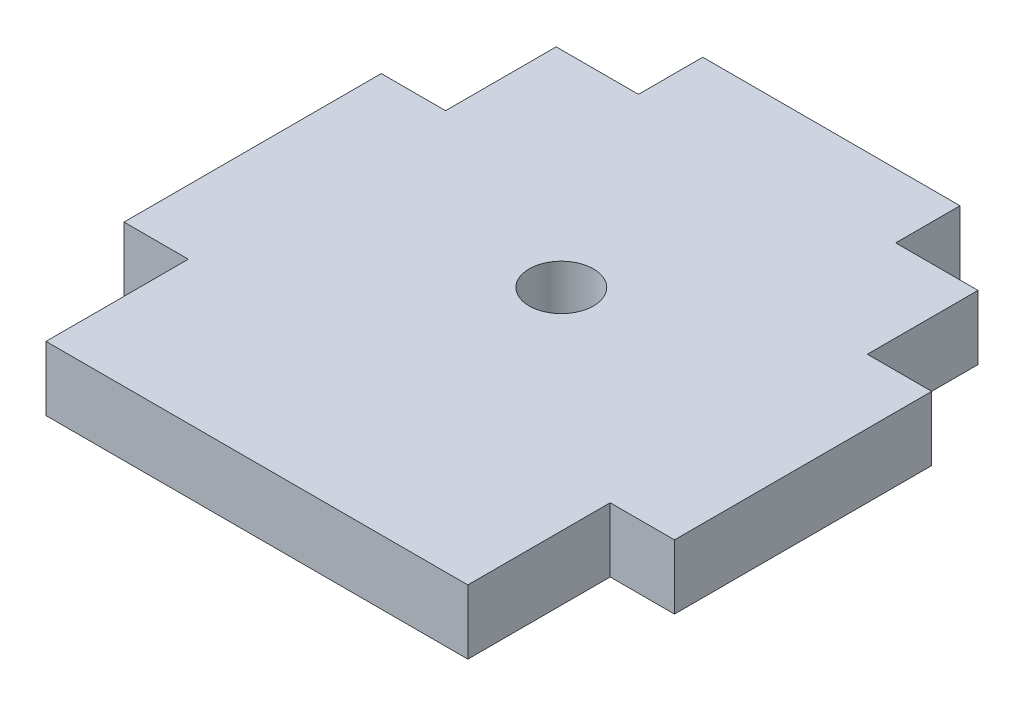
ISO-10303-21;
HEADER;
FILE_DESCRIPTION(('STEP AP214'),'2;1');
FILE_NAME('part.step','',(''),(''),'','','');
FILE_SCHEMA(('AUTOMOTIVE_DESIGN { 1 0 10303 214 1 1 1 1 }'));
ENDSEC;
DATA;
#1=APPLICATION_CONTEXT('core data for automotive mechanical design processes');
#2=APPLICATION_PROTOCOL_DEFINITION('international standard','automotive_design',2000,#1);
#3=PRODUCT_CONTEXT('',#1,'mechanical');
#4=PRODUCT('Part','Part','',(#3));
#5=PRODUCT_RELATED_PRODUCT_CATEGORY('part','',(#4));
#6=PRODUCT_DEFINITION_FORMATION('','',#4);
#7=PRODUCT_DEFINITION_CONTEXT('part definition',#1,'design');
#8=PRODUCT_DEFINITION('design','',#6,#7);
#9=PRODUCT_DEFINITION_SHAPE('','',#8);
#10=(LENGTH_UNIT() NAMED_UNIT(*) SI_UNIT(.MILLI.,.METRE.));
#11=(NAMED_UNIT(*) PLANE_ANGLE_UNIT() SI_UNIT($,.RADIAN.));
#12=(NAMED_UNIT(*) SI_UNIT($,.STERADIAN.) SOLID_ANGLE_UNIT());
#13=UNCERTAINTY_MEASURE_WITH_UNIT(LENGTH_MEASURE(1.E-05),#10,'distance_accuracy_value','');
#14=(GEOMETRIC_REPRESENTATION_CONTEXT(3) GLOBAL_UNCERTAINTY_ASSIGNED_CONTEXT((#13)) GLOBAL_UNIT_ASSIGNED_CONTEXT((#10,
#11,#12)) REPRESENTATION_CONTEXT('',''));
#15=CARTESIAN_POINT('',(0.,0.,0.));
#16=DIRECTION('',(0.,0.,1.));
#17=DIRECTION('',(1.,0.,0.));
#18=AXIS2_PLACEMENT_3D('',#15,#16,#17);
#19=CARTESIAN_POINT('',(0.,6.35,-14.0546666666667));
#20=DIRECTION('',(0.,1.,0.));
#21=DIRECTION('',(0.,0.,1.));
#22=AXIS2_PLACEMENT_3D('',#19,#20,#21);
#23=PLANE('',#22);
#24=DIRECTION('',(0.,0.,1.));
#25=VECTOR('',#24,1.);
#26=CARTESIAN_POINT('',(0.,6.35,0.));
#27=LINE('',#26,#25);
#28=CARTESIAN_POINT('',(0.,6.35,-14.0546666666667));
#29=VERTEX_POINT('',#28);
#30=CARTESIAN_POINT('',(0.,6.35,0.));
#31=VERTEX_POINT('',#30);
#32=EDGE_CURVE('E207',#29,#31,#27,.T.);
#33=ORIENTED_EDGE('',*,*,#32,.T.);
#34=DIRECTION('',(1.,0.,0.));
#35=VECTOR('',#34,1.);
#36=CARTESIAN_POINT('',(0.,6.35,0.));
#37=LINE('',#36,#35);
#38=CARTESIAN_POINT('',(41.656,6.35,0.));
#39=VERTEX_POINT('',#38);
#40=EDGE_CURVE('E115',#31,#39,#37,.T.);
#41=ORIENTED_EDGE('',*,*,#40,.T.);
#42=DIRECTION('',(0.,0.,-1.));
#43=VECTOR('',#42,1.);
#44=CARTESIAN_POINT('',(41.656,6.35,0.));
#45=LINE('',#44,#43);
#46=CARTESIAN_POINT('',(41.656,6.35,-14.0546666666667));
#47=VERTEX_POINT('',#46);
#48=EDGE_CURVE('E246',#39,#47,#45,.T.);
#49=ORIENTED_EDGE('',*,*,#48,.T.);
#50=DIRECTION('',(1.,0.,0.));
#51=VECTOR('',#50,1.);
#52=CARTESIAN_POINT('',(41.656,6.35,-14.0546666666667));
#53=LINE('',#52,#51);
#54=CARTESIAN_POINT('',(48.006,6.35,-14.0546666666667));
#55=VERTEX_POINT('',#54);
#56=EDGE_CURVE('E265',#47,#55,#53,.T.);
#57=ORIENTED_EDGE('',*,*,#56,.T.);
#58=DIRECTION('',(0.,0.,-1.));
#59=VECTOR('',#58,1.);
#60=CARTESIAN_POINT('',(48.006,6.35,-39.4546666666667));
#61=LINE('',#60,#59);
#62=CARTESIAN_POINT('',(48.006,6.35,-39.4546666666667));
#63=VERTEX_POINT('',#62);
#64=EDGE_CURVE('E262',#55,#63,#61,.T.);
#65=ORIENTED_EDGE('',*,*,#64,.T.);
#66=DIRECTION('',(-1.,0.,0.));
#67=VECTOR('',#66,1.);
#68=CARTESIAN_POINT('',(41.656,6.35,-39.4546666666667));
#69=LINE('',#68,#67);
#70=CARTESIAN_POINT('',(41.656,6.35,-39.4546666666667));
#71=VERTEX_POINT('',#70);
#72=EDGE_CURVE('E264',#63,#71,#69,.T.);
#73=ORIENTED_EDGE('',*,*,#72,.T.);
#74=DIRECTION('',(0.,0.,-1.));
#75=VECTOR('',#74,1.);
#76=CARTESIAN_POINT('',(41.656,6.35,-39.4546666666667));
#77=LINE('',#76,#75);
#78=CARTESIAN_POINT('',(41.656,6.35,-50.3766666666667));
#79=VERTEX_POINT('',#78);
#80=EDGE_CURVE('E267',#71,#79,#77,.T.);
#81=ORIENTED_EDGE('',*,*,#80,.T.);
#82=DIRECTION('',(-1.,0.,0.));
#83=VECTOR('',#82,1.);
#84=CARTESIAN_POINT('',(33.528,6.35,-50.3766666666667));
#85=LINE('',#84,#83);
#86=CARTESIAN_POINT('',(33.528,6.35,-50.3766666666667));
#87=VERTEX_POINT('',#86);
#88=EDGE_CURVE('E273',#79,#87,#85,.T.);
#89=ORIENTED_EDGE('',*,*,#88,.T.);
#90=DIRECTION('',(0.,0.,-1.));
#91=VECTOR('',#90,1.);
#92=CARTESIAN_POINT('',(33.528,6.35,-56.7266666666667));
#93=LINE('',#92,#91);
#94=CARTESIAN_POINT('',(33.528,6.35,-56.7266666666667));
#95=VERTEX_POINT('',#94);
#96=EDGE_CURVE('E275',#87,#95,#93,.T.);
#97=ORIENTED_EDGE('',*,*,#96,.T.);
#98=DIRECTION('',(-1.,0.,0.));
#99=VECTOR('',#98,1.);
#100=CARTESIAN_POINT('',(8.128,6.35,-56.7266666666667));
#101=LINE('',#100,#99);
#102=CARTESIAN_POINT('',(8.128,6.35,-56.7266666666667));
#103=VERTEX_POINT('',#102);
#104=EDGE_CURVE('E277',#95,#103,#101,.T.);
#105=ORIENTED_EDGE('',*,*,#104,.T.);
#106=DIRECTION('',(0.,0.,1.));
#107=VECTOR('',#106,1.);
#108=CARTESIAN_POINT('',(8.128,6.35,-50.3766666666667));
#109=LINE('',#108,#107);
#110=CARTESIAN_POINT('',(8.128,6.35,-50.3766666666667));
#111=VERTEX_POINT('',#110);
#112=EDGE_CURVE('E279',#103,#111,#109,.T.);
#113=ORIENTED_EDGE('',*,*,#112,.T.);
#114=DIRECTION('',(-1.,0.,0.));
#115=VECTOR('',#114,1.);
#116=CARTESIAN_POINT('',(0.,6.35,-50.3766666666667));
#117=LINE('',#116,#115);
#118=CARTESIAN_POINT('',(0.,6.35,-50.3766666666667));
#119=VERTEX_POINT('',#118);
#120=EDGE_CURVE('E281',#111,#119,#117,.T.);
#121=ORIENTED_EDGE('',*,*,#120,.T.);
#122=DIRECTION('',(0.,0.,1.));
#123=VECTOR('',#122,1.);
#124=CARTESIAN_POINT('',(0.,6.35,-39.4546666666667));
#125=LINE('',#124,#123);
#126=CARTESIAN_POINT('',(0.,6.35,-39.4546666666667));
#127=VERTEX_POINT('',#126);
#128=EDGE_CURVE('E158',#119,#127,#125,.T.);
#129=ORIENTED_EDGE('',*,*,#128,.T.);
#130=DIRECTION('',(-1.,0.,0.));
#131=VECTOR('',#130,1.);
#132=CARTESIAN_POINT('',(0.,6.35,-39.4546666666667));
#133=LINE('',#132,#131);
#134=CARTESIAN_POINT('',(-6.35,6.35,-39.4546666666667));
#135=VERTEX_POINT('',#134);
#136=EDGE_CURVE('E152',#127,#135,#133,.T.);
#137=ORIENTED_EDGE('',*,*,#136,.T.);
#138=DIRECTION('',(0.,0.,1.));
#139=VECTOR('',#138,1.);
#140=CARTESIAN_POINT('',(-6.35,6.35,-39.4546666666667));
#141=LINE('',#140,#139);
#142=CARTESIAN_POINT('',(-6.35,6.35,-14.0546666666667));
#143=VERTEX_POINT('',#142);
#144=EDGE_CURVE('E156',#135,#143,#141,.T.);
#145=ORIENTED_EDGE('',*,*,#144,.T.);
#146=DIRECTION('',(1.,0.,0.));
#147=VECTOR('',#146,1.);
#148=CARTESIAN_POINT('',(0.,6.35,-14.0546666666667));
#149=LINE('',#148,#147);
#150=EDGE_CURVE('E48',#143,#29,#149,.T.);
#151=ORIENTED_EDGE('',*,*,#150,.T.);
#152=EDGE_LOOP('',(#33,#41,#49,#57,#65,#73,#81,#89,#97,#105,#113,#121,#129,#137,#145,#151));
#153=FACE_BOUND('',#152,.T.);
#154=CARTESIAN_POINT('',(20.828,6.35,-30.0566666666667));
#155=DIRECTION('',(0.,1.,0.));
#156=DIRECTION('',(0.,0.,1.));
#157=AXIS2_PLACEMENT_3D('',#154,#155,#156);
#158=CIRCLE('',#157,3.175);
#159=CARTESIAN_POINT('',(20.828,6.35,-26.8816666666667));
#160=VERTEX_POINT('',#159);
#161=EDGE_CURVE('E180',#160,#160,#158,.T.);
#162=ORIENTED_EDGE('',*,*,#161,.F.);
#163=EDGE_LOOP('',(#162));
#164=FACE_BOUND('',#163,.T.);
#165=ADVANCED_FACE('F31',(#153,#164),#23,.T.);
#166=CARTESIAN_POINT('',(0.,0.,-14.0546666666667));
#167=DIRECTION('',(0.,1.,0.));
#168=DIRECTION('',(0.,0.,1.));
#169=AXIS2_PLACEMENT_3D('',#166,#167,#168);
#170=PLANE('',#169);
#171=DIRECTION('',(0.,0.,1.));
#172=VECTOR('',#171,1.);
#173=CARTESIAN_POINT('',(0.,0.,0.));
#174=LINE('',#173,#172);
#175=CARTESIAN_POINT('',(0.,0.,-14.0546666666667));
#176=VERTEX_POINT('',#175);
#177=CARTESIAN_POINT('',(0.,0.,0.));
#178=VERTEX_POINT('',#177);
#179=EDGE_CURVE('E176',#176,#178,#174,.T.);
#180=ORIENTED_EDGE('',*,*,#179,.F.);
#181=DIRECTION('',(1.,0.,0.));
#182=VECTOR('',#181,1.);
#183=CARTESIAN_POINT('',(0.,0.,-14.0546666666667));
#184=LINE('',#183,#182);
#185=CARTESIAN_POINT('',(-6.35,0.,-14.0546666666667));
#186=VERTEX_POINT('',#185);
#187=EDGE_CURVE('E107',#186,#176,#184,.T.);
#188=ORIENTED_EDGE('',*,*,#187,.F.);
#189=DIRECTION('',(0.,0.,1.));
#190=VECTOR('',#189,1.);
#191=CARTESIAN_POINT('',(-6.35,0.,-39.4546666666667));
#192=LINE('',#191,#190);
#193=CARTESIAN_POINT('',(-6.35,0.,-39.4546666666667));
#194=VERTEX_POINT('',#193);
#195=EDGE_CURVE('E101',#194,#186,#192,.T.);
#196=ORIENTED_EDGE('',*,*,#195,.F.);
#197=DIRECTION('',(-1.,0.,0.));
#198=VECTOR('',#197,1.);
#199=CARTESIAN_POINT('',(0.,0.,-39.4546666666667));
#200=LINE('',#199,#198);
#201=CARTESIAN_POINT('',(0.,0.,-39.4546666666667));
#202=VERTEX_POINT('',#201);
#203=EDGE_CURVE('E166',#202,#194,#200,.T.);
#204=ORIENTED_EDGE('',*,*,#203,.F.);
#205=DIRECTION('',(0.,0.,1.));
#206=VECTOR('',#205,1.);
#207=CARTESIAN_POINT('',(0.,0.,-39.4546666666667));
#208=LINE('',#207,#206);
#209=CARTESIAN_POINT('',(0.,0.,-50.3766666666667));
#210=VERTEX_POINT('',#209);
#211=EDGE_CURVE('E202',#210,#202,#208,.T.);
#212=ORIENTED_EDGE('',*,*,#211,.F.);
#213=DIRECTION('',(-1.,0.,0.));
#214=VECTOR('',#213,1.);
#215=CARTESIAN_POINT('',(0.,0.,-50.3766666666667));
#216=LINE('',#215,#214);
#217=CARTESIAN_POINT('',(8.128,0.,-50.3766666666667));
#218=VERTEX_POINT('',#217);
#219=EDGE_CURVE('E200',#218,#210,#216,.T.);
#220=ORIENTED_EDGE('',*,*,#219,.F.);
#221=DIRECTION('',(0.,0.,1.));
#222=VECTOR('',#221,1.);
#223=CARTESIAN_POINT('',(8.128,0.,-50.3766666666667));
#224=LINE('',#223,#222);
#225=CARTESIAN_POINT('',(8.128,0.,-56.7266666666667));
#226=VERTEX_POINT('',#225);
#227=EDGE_CURVE('E198',#226,#218,#224,.T.);
#228=ORIENTED_EDGE('',*,*,#227,.F.);
#229=DIRECTION('',(-1.,0.,0.));
#230=VECTOR('',#229,1.);
#231=CARTESIAN_POINT('',(8.128,0.,-56.7266666666667));
#232=LINE('',#231,#230);
#233=CARTESIAN_POINT('',(33.528,0.,-56.7266666666667));
#234=VERTEX_POINT('',#233);
#235=EDGE_CURVE('E196',#234,#226,#232,.T.);
#236=ORIENTED_EDGE('',*,*,#235,.F.);
#237=DIRECTION('',(0.,0.,-1.));
#238=VECTOR('',#237,1.);
#239=CARTESIAN_POINT('',(33.528,0.,-56.7266666666667));
#240=LINE('',#239,#238);
#241=CARTESIAN_POINT('',(33.528,0.,-50.3766666666667));
#242=VERTEX_POINT('',#241);
#243=EDGE_CURVE('E194',#242,#234,#240,.T.);
#244=ORIENTED_EDGE('',*,*,#243,.F.);
#245=DIRECTION('',(-1.,0.,0.));
#246=VECTOR('',#245,1.);
#247=CARTESIAN_POINT('',(33.528,0.,-50.3766666666667));
#248=LINE('',#247,#246);
#249=CARTESIAN_POINT('',(41.656,0.,-50.3766666666667));
#250=VERTEX_POINT('',#249);
#251=EDGE_CURVE('E192',#250,#242,#248,.T.);
#252=ORIENTED_EDGE('',*,*,#251,.F.);
#253=DIRECTION('',(0.,0.,-1.));
#254=VECTOR('',#253,1.);
#255=CARTESIAN_POINT('',(41.656,0.,-39.4546666666667));
#256=LINE('',#255,#254);
#257=CARTESIAN_POINT('',(41.656,0.,-39.4546666666667));
#258=VERTEX_POINT('',#257);
#259=EDGE_CURVE('E190',#258,#250,#256,.T.);
#260=ORIENTED_EDGE('',*,*,#259,.F.);
#261=DIRECTION('',(-1.,0.,0.));
#262=VECTOR('',#261,1.);
#263=CARTESIAN_POINT('',(41.656,0.,-39.4546666666667));
#264=LINE('',#263,#262);
#265=CARTESIAN_POINT('',(48.006,0.,-39.4546666666667));
#266=VERTEX_POINT('',#265);
#267=EDGE_CURVE('E188',#266,#258,#264,.T.);
#268=ORIENTED_EDGE('',*,*,#267,.F.);
#269=DIRECTION('',(0.,0.,-1.));
#270=VECTOR('',#269,1.);
#271=CARTESIAN_POINT('',(48.006,0.,-39.4546666666667));
#272=LINE('',#271,#270);
#273=CARTESIAN_POINT('',(48.006,0.,-14.0546666666667));
#274=VERTEX_POINT('',#273);
#275=EDGE_CURVE('E186',#274,#266,#272,.T.);
#276=ORIENTED_EDGE('',*,*,#275,.F.);
#277=DIRECTION('',(1.,0.,0.));
#278=VECTOR('',#277,1.);
#279=CARTESIAN_POINT('',(41.656,0.,-14.0546666666667));
#280=LINE('',#279,#278);
#281=CARTESIAN_POINT('',(41.656,0.,-14.0546666666667));
#282=VERTEX_POINT('',#281);
#283=EDGE_CURVE('E184',#282,#274,#280,.T.);
#284=ORIENTED_EDGE('',*,*,#283,.F.);
#285=DIRECTION('',(0.,0.,-1.));
#286=VECTOR('',#285,1.);
#287=CARTESIAN_POINT('',(41.656,0.,0.));
#288=LINE('',#287,#286);
#289=CARTESIAN_POINT('',(41.656,0.,0.));
#290=VERTEX_POINT('',#289);
#291=EDGE_CURVE('E182',#290,#282,#288,.T.);
#292=ORIENTED_EDGE('',*,*,#291,.F.);
#293=DIRECTION('',(1.,0.,0.));
#294=VECTOR('',#293,1.);
#295=CARTESIAN_POINT('',(0.,0.,0.));
#296=LINE('',#295,#294);
#297=EDGE_CURVE('E179',#178,#290,#296,.T.);
#298=ORIENTED_EDGE('',*,*,#297,.F.);
#299=EDGE_LOOP('',(#180,#188,#196,#204,#212,#220,#228,#236,#244,#252,#260,#268,#276,#284,#292,#298));
#300=FACE_BOUND('',#299,.T.);
#301=CARTESIAN_POINT('',(20.828,0.,-30.0566666666667));
#302=DIRECTION('',(0.,1.,0.));
#303=DIRECTION('',(0.,0.,1.));
#304=AXIS2_PLACEMENT_3D('',#301,#302,#303);
#305=CIRCLE('',#304,3.175);
#306=CARTESIAN_POINT('',(20.828,0.,-26.8816666666667));
#307=VERTEX_POINT('',#306);
#308=EDGE_CURVE('E480',#307,#307,#305,.T.);
#309=ORIENTED_EDGE('',*,*,#308,.T.);
#310=EDGE_LOOP('',(#309));
#311=FACE_BOUND('',#310,.T.);
#312=ADVANCED_FACE('F250',(#300,#311),#170,.F.);
#313=CARTESIAN_POINT('',(0.,6.35,0.));
#314=DIRECTION('',(1.,0.,0.));
#315=DIRECTION('',(0.,0.,-1.));
#316=AXIS2_PLACEMENT_3D('',#313,#314,#315);
#317=PLANE('',#316);
#318=ORIENTED_EDGE('',*,*,#179,.T.);
#319=DIRECTION('',(0.,-1.,0.));
#320=VECTOR('',#319,1.);
#321=CARTESIAN_POINT('',(0.,6.35,0.));
#322=LINE('',#321,#320);
#323=EDGE_CURVE('E11',#31,#178,#322,.T.);
#324=ORIENTED_EDGE('',*,*,#323,.F.);
#325=ORIENTED_EDGE('',*,*,#32,.F.);
#326=DIRECTION('',(0.,-1.,0.));
#327=VECTOR('',#326,1.);
#328=CARTESIAN_POINT('',(0.,6.35,-14.0546666666667));
#329=LINE('',#328,#327);
#330=EDGE_CURVE('E172',#29,#176,#329,.T.);
#331=ORIENTED_EDGE('',*,*,#330,.T.);
#332=EDGE_LOOP('',(#318,#324,#325,#331));
#333=FACE_BOUND('',#332,.T.);
#334=ADVANCED_FACE('F33',(#333),#317,.F.);
#335=CARTESIAN_POINT('',(0.,6.35,0.));
#336=DIRECTION('',(0.,0.,-1.));
#337=DIRECTION('',(-1.,0.,0.));
#338=AXIS2_PLACEMENT_3D('',#335,#336,#337);
#339=PLANE('',#338);
#340=ORIENTED_EDGE('',*,*,#297,.T.);
#341=DIRECTION('',(0.,-1.,0.));
#342=VECTOR('',#341,1.);
#343=CARTESIAN_POINT('',(41.656,6.35,0.));
#344=LINE('',#343,#342);
#345=EDGE_CURVE('E40',#39,#290,#344,.T.);
#346=ORIENTED_EDGE('',*,*,#345,.F.);
#347=ORIENTED_EDGE('',*,*,#40,.F.);
#348=ORIENTED_EDGE('',*,*,#323,.T.);
#349=EDGE_LOOP('',(#340,#346,#347,#348));
#350=FACE_BOUND('',#349,.T.);
#351=ADVANCED_FACE('F315',(#350),#339,.F.);
#352=CARTESIAN_POINT('',(41.656,6.35,0.));
#353=DIRECTION('',(-1.,0.,0.));
#354=DIRECTION('',(0.,0.,1.));
#355=AXIS2_PLACEMENT_3D('',#352,#353,#354);
#356=PLANE('',#355);
#357=ORIENTED_EDGE('',*,*,#291,.T.);
#358=DIRECTION('',(0.,-1.,0.));
#359=VECTOR('',#358,1.);
#360=CARTESIAN_POINT('',(41.656,6.35,-14.0546666666667));
#361=LINE('',#360,#359);
#362=EDGE_CURVE('E238',#47,#282,#361,.T.);
#363=ORIENTED_EDGE('',*,*,#362,.F.);
#364=ORIENTED_EDGE('',*,*,#48,.F.);
#365=ORIENTED_EDGE('',*,*,#345,.T.);
#366=EDGE_LOOP('',(#357,#363,#364,#365));
#367=FACE_BOUND('',#366,.T.);
#368=ADVANCED_FACE('F244',(#367),#356,.F.);
#369=CARTESIAN_POINT('',(41.656,6.35,-14.0546666666667));
#370=DIRECTION('',(0.,0.,-1.));
#371=DIRECTION('',(-1.,0.,0.));
#372=AXIS2_PLACEMENT_3D('',#369,#370,#371);
#373=PLANE('',#372);
#374=ORIENTED_EDGE('',*,*,#283,.T.);
#375=DIRECTION('',(0.,-1.,0.));
#376=VECTOR('',#375,1.);
#377=CARTESIAN_POINT('',(48.006,6.35,-14.0546666666667));
#378=LINE('',#377,#376);
#379=EDGE_CURVE('E235',#55,#274,#378,.T.);
#380=ORIENTED_EDGE('',*,*,#379,.F.);
#381=ORIENTED_EDGE('',*,*,#56,.F.);
#382=ORIENTED_EDGE('',*,*,#362,.T.);
#383=EDGE_LOOP('',(#374,#380,#381,#382));
#384=FACE_BOUND('',#383,.T.);
#385=ADVANCED_FACE('F256',(#384),#373,.F.);
#386=CARTESIAN_POINT('',(48.006,6.35,-39.4546666666667));
#387=DIRECTION('',(-1.,0.,0.));
#388=DIRECTION('',(0.,0.,1.));
#389=AXIS2_PLACEMENT_3D('',#386,#387,#388);
#390=PLANE('',#389);
#391=ORIENTED_EDGE('',*,*,#275,.T.);
#392=DIRECTION('',(0.,-1.,0.));
#393=VECTOR('',#392,1.);
#394=CARTESIAN_POINT('',(48.006,6.35,-39.4546666666667));
#395=LINE('',#394,#393);
#396=EDGE_CURVE('E232',#63,#266,#395,.T.);
#397=ORIENTED_EDGE('',*,*,#396,.F.);
#398=ORIENTED_EDGE('',*,*,#64,.F.);
#399=ORIENTED_EDGE('',*,*,#379,.T.);
#400=EDGE_LOOP('',(#391,#397,#398,#399));
#401=FACE_BOUND('',#400,.T.);
#402=ADVANCED_FACE('F260',(#401),#390,.F.);
#403=CARTESIAN_POINT('',(41.656,6.35,-39.4546666666667));
#404=DIRECTION('',(0.,0.,1.));
#405=DIRECTION('',(1.,0.,0.));
#406=AXIS2_PLACEMENT_3D('',#403,#404,#405);
#407=PLANE('',#406);
#408=ORIENTED_EDGE('',*,*,#267,.T.);
#409=DIRECTION('',(0.,-1.,0.));
#410=VECTOR('',#409,1.);
#411=CARTESIAN_POINT('',(41.656,6.35,-39.4546666666667));
#412=LINE('',#411,#410);
#413=EDGE_CURVE('E229',#71,#258,#412,.T.);
#414=ORIENTED_EDGE('',*,*,#413,.F.);
#415=ORIENTED_EDGE('',*,*,#72,.F.);
#416=ORIENTED_EDGE('',*,*,#396,.T.);
#417=EDGE_LOOP('',(#408,#414,#415,#416));
#418=FACE_BOUND('',#417,.T.);
#419=ADVANCED_FACE('F328',(#418),#407,.F.);
#420=CARTESIAN_POINT('',(41.656,6.35,-39.4546666666667));
#421=DIRECTION('',(-1.,0.,0.));
#422=DIRECTION('',(0.,0.,1.));
#423=AXIS2_PLACEMENT_3D('',#420,#421,#422);
#424=PLANE('',#423);
#425=ORIENTED_EDGE('',*,*,#259,.T.);
#426=DIRECTION('',(0.,-1.,0.));
#427=VECTOR('',#426,1.);
#428=CARTESIAN_POINT('',(41.656,6.35,-50.3766666666667));
#429=LINE('',#428,#427);
#430=EDGE_CURVE('E226',#79,#250,#429,.T.);
#431=ORIENTED_EDGE('',*,*,#430,.F.);
#432=ORIENTED_EDGE('',*,*,#80,.F.);
#433=ORIENTED_EDGE('',*,*,#413,.T.);
#434=EDGE_LOOP('',(#425,#431,#432,#433));
#435=FACE_BOUND('',#434,.T.);
#436=ADVANCED_FACE('F331',(#435),#424,.F.);
#437=CARTESIAN_POINT('',(33.528,6.35,-50.3766666666667));
#438=DIRECTION('',(0.,0.,1.));
#439=DIRECTION('',(1.,0.,0.));
#440=AXIS2_PLACEMENT_3D('',#437,#438,#439);
#441=PLANE('',#440);
#442=ORIENTED_EDGE('',*,*,#251,.T.);
#443=DIRECTION('',(0.,-1.,0.));
#444=VECTOR('',#443,1.);
#445=CARTESIAN_POINT('',(33.528,6.35,-50.3766666666667));
#446=LINE('',#445,#444);
#447=EDGE_CURVE('E223',#87,#242,#446,.T.);
#448=ORIENTED_EDGE('',*,*,#447,.F.);
#449=ORIENTED_EDGE('',*,*,#88,.F.);
#450=ORIENTED_EDGE('',*,*,#430,.T.);
#451=EDGE_LOOP('',(#442,#448,#449,#450));
#452=FACE_BOUND('',#451,.T.);
#453=ADVANCED_FACE('F335',(#452),#441,.F.);
#454=CARTESIAN_POINT('',(33.528,6.35,-56.7266666666667));
#455=DIRECTION('',(-1.,0.,0.));
#456=DIRECTION('',(0.,0.,1.));
#457=AXIS2_PLACEMENT_3D('',#454,#455,#456);
#458=PLANE('',#457);
#459=ORIENTED_EDGE('',*,*,#243,.T.);
#460=DIRECTION('',(0.,-1.,0.));
#461=VECTOR('',#460,1.);
#462=CARTESIAN_POINT('',(33.528,6.35,-56.7266666666667));
#463=LINE('',#462,#461);
#464=EDGE_CURVE('E220',#95,#234,#463,.T.);
#465=ORIENTED_EDGE('',*,*,#464,.F.);
#466=ORIENTED_EDGE('',*,*,#96,.F.);
#467=ORIENTED_EDGE('',*,*,#447,.T.);
#468=EDGE_LOOP('',(#459,#465,#466,#467));
#469=FACE_BOUND('',#468,.T.);
#470=ADVANCED_FACE('F339',(#469),#458,.F.);
#471=CARTESIAN_POINT('',(8.128,6.35,-56.7266666666667));
#472=DIRECTION('',(0.,0.,1.));
#473=DIRECTION('',(1.,0.,0.));
#474=AXIS2_PLACEMENT_3D('',#471,#472,#473);
#475=PLANE('',#474);
#476=ORIENTED_EDGE('',*,*,#235,.T.);
#477=DIRECTION('',(0.,-1.,0.));
#478=VECTOR('',#477,1.);
#479=CARTESIAN_POINT('',(8.128,6.35,-56.7266666666667));
#480=LINE('',#479,#478);
#481=EDGE_CURVE('E217',#103,#226,#480,.T.);
#482=ORIENTED_EDGE('',*,*,#481,.F.);
#483=ORIENTED_EDGE('',*,*,#104,.F.);
#484=ORIENTED_EDGE('',*,*,#464,.T.);
#485=EDGE_LOOP('',(#476,#482,#483,#484));
#486=FACE_BOUND('',#485,.T.);
#487=ADVANCED_FACE('F343',(#486),#475,.F.);
#488=CARTESIAN_POINT('',(8.128,6.35,-50.3766666666667));
#489=DIRECTION('',(1.,0.,0.));
#490=DIRECTION('',(0.,0.,-1.));
#491=AXIS2_PLACEMENT_3D('',#488,#489,#490);
#492=PLANE('',#491);
#493=ORIENTED_EDGE('',*,*,#227,.T.);
#494=DIRECTION('',(0.,-1.,0.));
#495=VECTOR('',#494,1.);
#496=CARTESIAN_POINT('',(8.128,6.35,-50.3766666666667));
#497=LINE('',#496,#495);
#498=EDGE_CURVE('E214',#111,#218,#497,.T.);
#499=ORIENTED_EDGE('',*,*,#498,.F.);
#500=ORIENTED_EDGE('',*,*,#112,.F.);
#501=ORIENTED_EDGE('',*,*,#481,.T.);
#502=EDGE_LOOP('',(#493,#499,#500,#501));
#503=FACE_BOUND('',#502,.T.);
#504=ADVANCED_FACE('F347',(#503),#492,.F.);
#505=CARTESIAN_POINT('',(0.,6.35,-50.3766666666667));
#506=DIRECTION('',(0.,0.,1.));
#507=DIRECTION('',(1.,0.,0.));
#508=AXIS2_PLACEMENT_3D('',#505,#506,#507);
#509=PLANE('',#508);
#510=ORIENTED_EDGE('',*,*,#219,.T.);
#511=DIRECTION('',(0.,-1.,0.));
#512=VECTOR('',#511,1.);
#513=CARTESIAN_POINT('',(0.,6.35,-50.3766666666667));
#514=LINE('',#513,#512);
#515=EDGE_CURVE('E211',#119,#210,#514,.T.);
#516=ORIENTED_EDGE('',*,*,#515,.F.);
#517=ORIENTED_EDGE('',*,*,#120,.F.);
#518=ORIENTED_EDGE('',*,*,#498,.T.);
#519=EDGE_LOOP('',(#510,#516,#517,#518));
#520=FACE_BOUND('',#519,.T.);
#521=ADVANCED_FACE('F287',(#520),#509,.F.);
#522=CARTESIAN_POINT('',(0.,6.35,-39.4546666666667));
#523=DIRECTION('',(1.,0.,0.));
#524=DIRECTION('',(0.,0.,-1.));
#525=AXIS2_PLACEMENT_3D('',#522,#523,#524);
#526=PLANE('',#525);
#527=ORIENTED_EDGE('',*,*,#211,.T.);
#528=DIRECTION('',(0.,-1.,0.));
#529=VECTOR('',#528,1.);
#530=CARTESIAN_POINT('',(0.,6.35,-39.4546666666667));
#531=LINE('',#530,#529);
#532=EDGE_CURVE('E167',#127,#202,#531,.T.);
#533=ORIENTED_EDGE('',*,*,#532,.F.);
#534=ORIENTED_EDGE('',*,*,#128,.F.);
#535=ORIENTED_EDGE('',*,*,#515,.T.);
#536=EDGE_LOOP('',(#527,#533,#534,#535));
#537=FACE_BOUND('',#536,.T.);
#538=ADVANCED_FACE('F291',(#537),#526,.F.);
#539=CARTESIAN_POINT('',(0.,6.35,-39.4546666666667));
#540=DIRECTION('',(0.,0.,1.));
#541=DIRECTION('',(1.,0.,0.));
#542=AXIS2_PLACEMENT_3D('',#539,#540,#541);
#543=PLANE('',#542);
#544=ORIENTED_EDGE('',*,*,#203,.T.);
#545=DIRECTION('',(0.,-1.,0.));
#546=VECTOR('',#545,1.);
#547=CARTESIAN_POINT('',(-6.35,6.35,-39.4546666666667));
#548=LINE('',#547,#546);
#549=EDGE_CURVE('E163',#135,#194,#548,.T.);
#550=ORIENTED_EDGE('',*,*,#549,.F.);
#551=ORIENTED_EDGE('',*,*,#136,.F.);
#552=ORIENTED_EDGE('',*,*,#532,.T.);
#553=EDGE_LOOP('',(#544,#550,#551,#552));
#554=FACE_BOUND('',#553,.T.);
#555=ADVANCED_FACE('F164',(#554),#543,.F.);
#556=CARTESIAN_POINT('',(-6.35,6.35,-39.4546666666667));
#557=DIRECTION('',(1.,0.,0.));
#558=DIRECTION('',(0.,0.,-1.));
#559=AXIS2_PLACEMENT_3D('',#556,#557,#558);
#560=PLANE('',#559);
#561=ORIENTED_EDGE('',*,*,#195,.T.);
#562=DIRECTION('',(0.,-1.,0.));
#563=VECTOR('',#562,1.);
#564=CARTESIAN_POINT('',(-6.35,6.35,-14.0546666666667));
#565=LINE('',#564,#563);
#566=EDGE_CURVE('E168',#143,#186,#565,.T.);
#567=ORIENTED_EDGE('',*,*,#566,.F.);
#568=ORIENTED_EDGE('',*,*,#144,.F.);
#569=ORIENTED_EDGE('',*,*,#549,.T.);
#570=EDGE_LOOP('',(#561,#567,#568,#569));
#571=FACE_BOUND('',#570,.T.);
#572=ADVANCED_FACE('F170',(#571),#560,.F.);
#573=CARTESIAN_POINT('',(0.,6.35,-14.0546666666667));
#574=DIRECTION('',(0.,0.,-1.));
#575=DIRECTION('',(-1.,0.,0.));
#576=AXIS2_PLACEMENT_3D('',#573,#574,#575);
#577=PLANE('',#576);
#578=ORIENTED_EDGE('',*,*,#187,.T.);
#579=ORIENTED_EDGE('',*,*,#330,.F.);
#580=ORIENTED_EDGE('',*,*,#150,.F.);
#581=ORIENTED_EDGE('',*,*,#566,.T.);
#582=EDGE_LOOP('',(#578,#579,#580,#581));
#583=FACE_BOUND('',#582,.T.);
#584=ADVANCED_FACE('F295',(#583),#577,.F.);
#585=CARTESIAN_POINT('',(20.828,6.35,-30.0566666666667));
#586=DIRECTION('',(0.,-1.,0.));
#587=DIRECTION('',(0.,0.,-1.));
#588=AXIS2_PLACEMENT_3D('',#585,#586,#587);
#589=CYLINDRICAL_SURFACE('',#588,3.175);
#590=ORIENTED_EDGE('',*,*,#161,.T.);
#591=EDGE_LOOP('',(#590));
#592=FACE_BOUND('',#591,.T.);
#593=ORIENTED_EDGE('',*,*,#308,.F.);
#594=EDGE_LOOP('',(#593));
#595=FACE_BOUND('',#594,.T.);
#596=ADVANCED_FACE('F297',(#592,#595),#589,.F.);
#597=CLOSED_SHELL('',(#165,#312,#334,#351,#368,#385,#402,#419,#436,#453,#470,#487,#504,#521,
#538,#555,#572,#584,#596));
#598=MANIFOLD_SOLID_BREP('B2',#597);
#599=ADVANCED_BREP_SHAPE_REPRESENTATION('',(#18,#598),#14);
#600=SHAPE_DEFINITION_REPRESENTATION(#9,#599);
ENDSEC;
END-ISO-10303-21;
